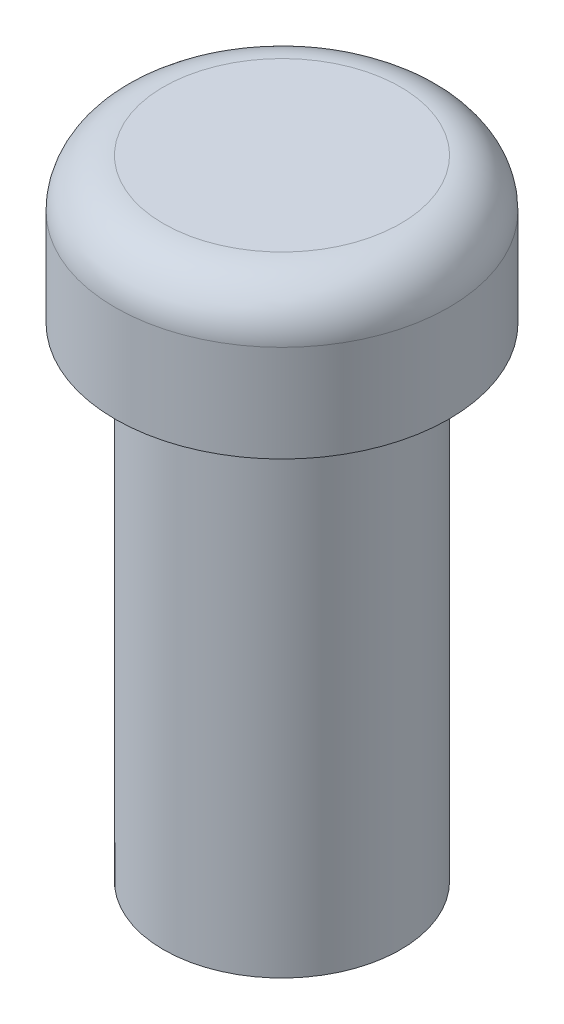
ISO-10303-21;
HEADER;
FILE_DESCRIPTION(('STEP AP214'),'2;1');
FILE_NAME('part.step','',(''),(''),'','','');
FILE_SCHEMA(('AUTOMOTIVE_DESIGN { 1 0 10303 214 1 1 1 1 }'));
ENDSEC;
DATA;
#1=APPLICATION_CONTEXT('core data for automotive mechanical design processes');
#2=APPLICATION_PROTOCOL_DEFINITION('international standard','automotive_design',2000,#1);
#3=PRODUCT_CONTEXT('',#1,'mechanical');
#4=PRODUCT('Part','Part','',(#3));
#5=PRODUCT_RELATED_PRODUCT_CATEGORY('part','',(#4));
#6=PRODUCT_DEFINITION_FORMATION('','',#4);
#7=PRODUCT_DEFINITION_CONTEXT('part definition',#1,'design');
#8=PRODUCT_DEFINITION('design','',#6,#7);
#9=PRODUCT_DEFINITION_SHAPE('','',#8);
#10=(LENGTH_UNIT() NAMED_UNIT(*) SI_UNIT(.MILLI.,.METRE.));
#11=(NAMED_UNIT(*) PLANE_ANGLE_UNIT() SI_UNIT($,.RADIAN.));
#12=(NAMED_UNIT(*) SI_UNIT($,.STERADIAN.) SOLID_ANGLE_UNIT());
#13=UNCERTAINTY_MEASURE_WITH_UNIT(LENGTH_MEASURE(1.E-05),#10,'distance_accuracy_value','');
#14=(GEOMETRIC_REPRESENTATION_CONTEXT(3) GLOBAL_UNCERTAINTY_ASSIGNED_CONTEXT((#13)) GLOBAL_UNIT_ASSIGNED_CONTEXT((#10,
#11,#12)) REPRESENTATION_CONTEXT('',''));
#15=CARTESIAN_POINT('',(0.,0.,0.));
#16=DIRECTION('',(0.,0.,1.));
#17=DIRECTION('',(1.,0.,0.));
#18=AXIS2_PLACEMENT_3D('',#15,#16,#17);
#19=CARTESIAN_POINT('',(0.,10.,0.));
#20=DIRECTION('',(0.,-1.,0.));
#21=DIRECTION('',(0.,0.,-1.));
#22=AXIS2_PLACEMENT_3D('',#19,#20,#21);
#23=CYLINDRICAL_SURFACE('',#22,2.45);
#24=CARTESIAN_POINT('',(0.,10.,0.));
#25=DIRECTION('',(0.,1.,0.));
#26=DIRECTION('',(0.,0.,1.));
#27=AXIS2_PLACEMENT_3D('',#24,#25,#26);
#28=CIRCLE('',#27,2.45);
#29=CARTESIAN_POINT('',(0.,10.,2.45));
#30=VERTEX_POINT('',#29);
#31=EDGE_CURVE('E52',#30,#30,#28,.T.);
#32=ORIENTED_EDGE('',*,*,#31,.F.);
#33=EDGE_LOOP('',(#32));
#34=FACE_BOUND('',#33,.T.);
#35=CARTESIAN_POINT('',(0.,0.,0.));
#36=DIRECTION('',(0.,1.,0.));
#37=DIRECTION('',(0.,0.,1.));
#38=AXIS2_PLACEMENT_3D('',#35,#36,#37);
#39=CIRCLE('',#38,2.45);
#40=CARTESIAN_POINT('',(0.,0.,2.45));
#41=VERTEX_POINT('',#40);
#42=EDGE_CURVE('E57',#41,#41,#39,.T.);
#43=ORIENTED_EDGE('',*,*,#42,.T.);
#44=EDGE_LOOP('',(#43));
#45=FACE_BOUND('',#44,.T.);
#46=ADVANCED_FACE('F39',(#34,#45),#23,.T.);
#47=CARTESIAN_POINT('',(0.,0.,0.));
#48=DIRECTION('',(0.,1.,0.));
#49=DIRECTION('',(0.,0.,1.));
#50=AXIS2_PLACEMENT_3D('',#47,#48,#49);
#51=PLANE('',#50);
#52=ORIENTED_EDGE('',*,*,#42,.F.);
#53=EDGE_LOOP('',(#52));
#54=FACE_BOUND('',#53,.T.);
#55=ADVANCED_FACE('F83',(#54),#51,.F.);
#56=CARTESIAN_POINT('',(0.,13.,0.));
#57=DIRECTION('',(0.,-1.,0.));
#58=DIRECTION('',(0.,0.,-1.));
#59=AXIS2_PLACEMENT_3D('',#56,#57,#58);
#60=CYLINDRICAL_SURFACE('',#59,3.45);
#61=CARTESIAN_POINT('',(0.,12.,0.));
#62=DIRECTION('',(0.,1.,0.));
#63=DIRECTION('',(0.,0.,1.));
#64=AXIS2_PLACEMENT_3D('',#61,#62,#63);
#65=CIRCLE('',#64,3.45);
#66=CARTESIAN_POINT('',(0.,12.,3.45));
#67=VERTEX_POINT('',#66);
#68=EDGE_CURVE('E10',#67,#67,#65,.F.);
#69=ORIENTED_EDGE('',*,*,#68,.T.);
#70=EDGE_LOOP('',(#69));
#71=FACE_BOUND('',#70,.T.);
#72=CARTESIAN_POINT('',(0.,10.,0.));
#73=DIRECTION('',(0.,1.,0.));
#74=DIRECTION('',(0.,0.,1.));
#75=AXIS2_PLACEMENT_3D('',#72,#73,#74);
#76=CIRCLE('',#75,3.45);
#77=CARTESIAN_POINT('',(0.,10.,3.45));
#78=VERTEX_POINT('',#77);
#79=EDGE_CURVE('E62',#78,#78,#76,.T.);
#80=ORIENTED_EDGE('',*,*,#79,.T.);
#81=EDGE_LOOP('',(#80));
#82=FACE_BOUND('',#81,.T.);
#83=ADVANCED_FACE('F68',(#71,#82),#60,.T.);
#84=CARTESIAN_POINT('',(0.,13.,0.));
#85=DIRECTION('',(0.,1.,0.));
#86=DIRECTION('',(0.,0.,1.));
#87=AXIS2_PLACEMENT_3D('',#84,#85,#86);
#88=PLANE('',#87);
#89=CARTESIAN_POINT('',(0.,13.,0.));
#90=DIRECTION('',(0.,1.,0.));
#91=DIRECTION('',(0.,0.,1.));
#92=AXIS2_PLACEMENT_3D('',#89,#90,#91);
#93=CIRCLE('',#92,2.45);
#94=CARTESIAN_POINT('',(0.,13.,2.45));
#95=VERTEX_POINT('',#94);
#96=EDGE_CURVE('E47',#95,#95,#93,.T.);
#97=ORIENTED_EDGE('',*,*,#96,.T.);
#98=EDGE_LOOP('',(#97));
#99=FACE_BOUND('',#98,.T.);
#100=ADVANCED_FACE('F72',(#99),#88,.T.);
#101=CARTESIAN_POINT('',(0.,10.,0.));
#102=DIRECTION('',(0.,1.,0.));
#103=DIRECTION('',(0.,0.,1.));
#104=AXIS2_PLACEMENT_3D('',#101,#102,#103);
#105=PLANE('',#104);
#106=ORIENTED_EDGE('',*,*,#31,.T.);
#107=EDGE_LOOP('',(#106));
#108=FACE_BOUND('',#107,.T.);
#109=ORIENTED_EDGE('',*,*,#79,.F.);
#110=EDGE_LOOP('',(#109));
#111=FACE_BOUND('',#110,.T.);
#112=ADVANCED_FACE('F70',(#108,#111),#105,.F.);
#113=CARTESIAN_POINT('',(0.,12.,0.));
#114=DIRECTION('',(0.,1.,0.));
#115=DIRECTION('',(0.,0.,1.));
#116=AXIS2_PLACEMENT_3D('',#113,#114,#115);
#117=TOROIDAL_SURFACE('',#116,2.45,1.);
#118=ORIENTED_EDGE('',*,*,#68,.F.);
#119=EDGE_LOOP('',(#118));
#120=FACE_BOUND('',#119,.T.);
#121=ORIENTED_EDGE('',*,*,#96,.F.);
#122=EDGE_LOOP('',(#121));
#123=FACE_BOUND('',#122,.T.);
#124=ADVANCED_FACE('F41',(#120,#123),#117,.T.);
#125=CLOSED_SHELL('',(#46,#55,#83,#100,#112,#124));
#126=MANIFOLD_SOLID_BREP('B2',#125);
#127=ADVANCED_BREP_SHAPE_REPRESENTATION('',(#18,#126),#14);
#128=SHAPE_DEFINITION_REPRESENTATION(#9,#127);
ENDSEC;
END-ISO-10303-21;
